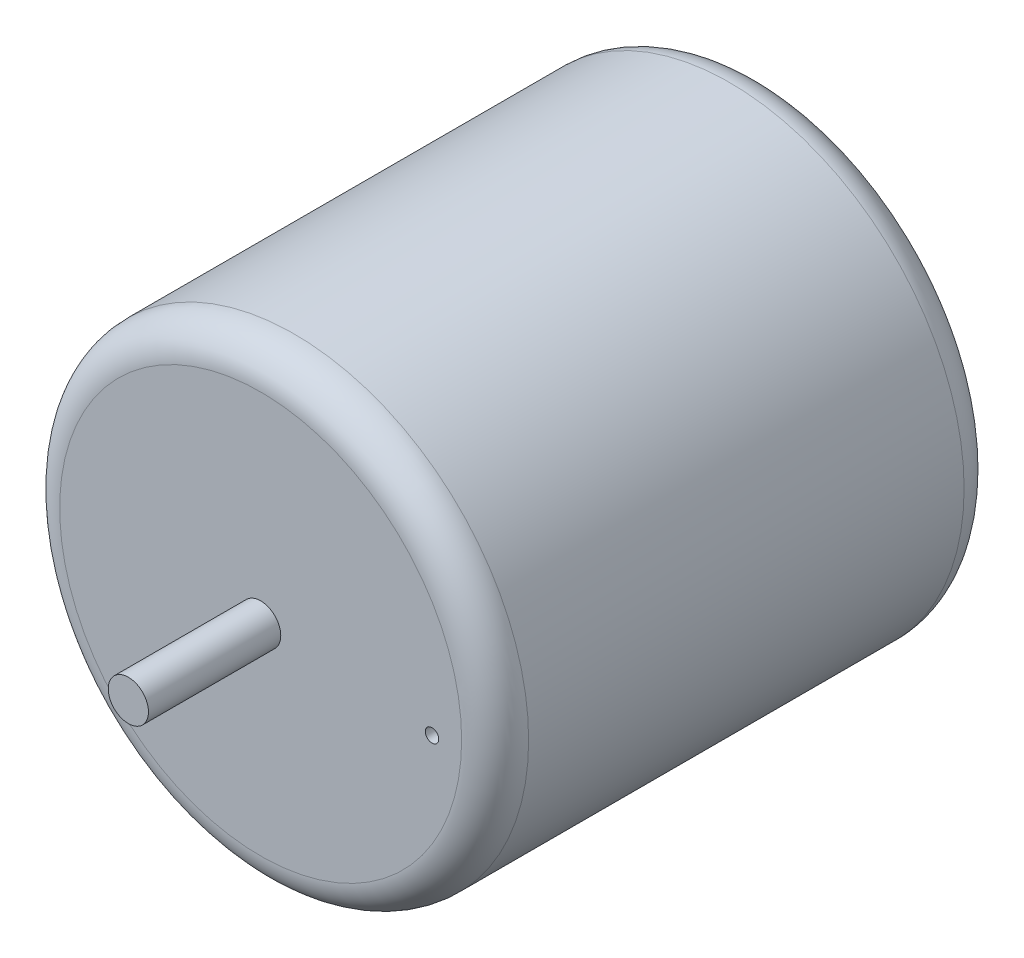
ISO-10303-21;
HEADER;
FILE_DESCRIPTION(('STEP AP214'),'2;1');
FILE_NAME('part.step','',(''),(''),'','','');
FILE_SCHEMA(('AUTOMOTIVE_DESIGN { 1 0 10303 214 1 1 1 1 }'));
ENDSEC;
DATA;
#1=APPLICATION_CONTEXT('core data for automotive mechanical design processes');
#2=APPLICATION_PROTOCOL_DEFINITION('international standard','automotive_design',2000,#1);
#3=PRODUCT_CONTEXT('',#1,'mechanical');
#4=PRODUCT('Part','Part','',(#3));
#5=PRODUCT_RELATED_PRODUCT_CATEGORY('part','',(#4));
#6=PRODUCT_DEFINITION_FORMATION('','',#4);
#7=PRODUCT_DEFINITION_CONTEXT('part definition',#1,'design');
#8=PRODUCT_DEFINITION('design','',#6,#7);
#9=PRODUCT_DEFINITION_SHAPE('','',#8);
#10=(LENGTH_UNIT() NAMED_UNIT(*) SI_UNIT(.MILLI.,.METRE.));
#11=(NAMED_UNIT(*) PLANE_ANGLE_UNIT() SI_UNIT($,.RADIAN.));
#12=(NAMED_UNIT(*) SI_UNIT($,.STERADIAN.) SOLID_ANGLE_UNIT());
#13=UNCERTAINTY_MEASURE_WITH_UNIT(LENGTH_MEASURE(1.E-05),#10,'distance_accuracy_value','');
#14=(GEOMETRIC_REPRESENTATION_CONTEXT(3) GLOBAL_UNCERTAINTY_ASSIGNED_CONTEXT((#13)) GLOBAL_UNIT_ASSIGNED_CONTEXT((#10,
#11,#12)) REPRESENTATION_CONTEXT('',''));
#15=CARTESIAN_POINT('',(0.,0.,0.));
#16=DIRECTION('',(0.,0.,1.));
#17=DIRECTION('',(1.,0.,0.));
#18=AXIS2_PLACEMENT_3D('',#15,#16,#17);
#19=CARTESIAN_POINT('',(0.,0.,7.5));
#20=DIRECTION('',(0.,0.,1.));
#21=DIRECTION('',(1.,0.,0.));
#22=AXIS2_PLACEMENT_3D('',#19,#20,#21);
#23=PLANE('',#22);
#24=CARTESIAN_POINT('',(5.11527520381937,-0.322145194133611,7.5));
#25=DIRECTION('',(0.,0.,1.));
#26=DIRECTION('',(1.,0.,0.));
#27=AXIS2_PLACEMENT_3D('',#24,#25,#26);
#28=CIRCLE('',#27,0.2);
#29=CARTESIAN_POINT('',(5.31527520381937,-0.322145194133611,7.5));
#30=VERTEX_POINT('',#29);
#31=EDGE_CURVE('P0_E72',#30,#30,#28,.T.);
#32=ORIENTED_EDGE('',*,*,#31,.F.);
#33=EDGE_LOOP('',(#32));
#34=FACE_BOUND('',#33,.T.);
#35=CARTESIAN_POINT('',(0.,0.,7.5));
#36=DIRECTION('',(0.,0.,1.));
#37=DIRECTION('',(1.,0.,0.));
#38=AXIS2_PLACEMENT_3D('',#35,#36,#37);
#39=CIRCLE('',#38,6.);
#40=CARTESIAN_POINT('',(6.,0.,7.5));
#41=VERTEX_POINT('',#40);
#42=EDGE_CURVE('P0_E10',#41,#41,#39,.T.);
#43=ORIENTED_EDGE('',*,*,#42,.T.);
#44=EDGE_LOOP('',(#43));
#45=FACE_BOUND('',#44,.T.);
#46=CARTESIAN_POINT('',(0.,0.,7.5));
#47=DIRECTION('',(0.,0.,1.));
#48=DIRECTION('',(1.,0.,0.));
#49=AXIS2_PLACEMENT_3D('',#46,#47,#48);
#50=CIRCLE('',#49,0.6);
#51=CARTESIAN_POINT('',(0.6,0.,7.5));
#52=VERTEX_POINT('',#51);
#53=EDGE_CURVE('P0_E55',#52,#52,#50,.T.);
#54=ORIENTED_EDGE('',*,*,#53,.F.);
#55=EDGE_LOOP('',(#54));
#56=FACE_BOUND('',#55,.T.);
#57=ADVANCED_FACE('P0_F40',(#34,#45,#56),#23,.T.);
#58=CARTESIAN_POINT('',(0.,0.,-7.5));
#59=DIRECTION('',(0.,0.,1.));
#60=DIRECTION('',(1.,0.,0.));
#61=AXIS2_PLACEMENT_3D('',#58,#59,#60);
#62=PLANE('',#61);
#63=CARTESIAN_POINT('',(5.11527520381937,-0.322145194133611,-7.5));
#64=DIRECTION('',(0.,0.,1.));
#65=DIRECTION('',(1.,0.,0.));
#66=AXIS2_PLACEMENT_3D('',#63,#64,#65);
#67=CIRCLE('',#66,0.2);
#68=CARTESIAN_POINT('',(5.31527520381937,-0.322145194133611,-7.5));
#69=VERTEX_POINT('',#68);
#70=EDGE_CURVE('P0_E44',#69,#69,#67,.T.);
#71=ORIENTED_EDGE('',*,*,#70,.T.);
#72=EDGE_LOOP('',(#71));
#73=FACE_BOUND('',#72,.T.);
#74=CARTESIAN_POINT('',(0.,0.,-7.5));
#75=DIRECTION('',(0.,0.,1.));
#76=DIRECTION('',(1.,0.,0.));
#77=AXIS2_PLACEMENT_3D('',#74,#75,#76);
#78=CIRCLE('',#77,6.);
#79=CARTESIAN_POINT('',(6.,0.,-7.5));
#80=VERTEX_POINT('',#79);
#81=EDGE_CURVE('P0_E49',#80,#80,#78,.T.);
#82=ORIENTED_EDGE('',*,*,#81,.F.);
#83=EDGE_LOOP('',(#82));
#84=FACE_BOUND('',#83,.T.);
#85=CARTESIAN_POINT('',(0.,0.,-7.5));
#86=DIRECTION('',(0.,0.,1.));
#87=DIRECTION('',(1.,0.,0.));
#88=AXIS2_PLACEMENT_3D('',#85,#86,#87);
#89=CIRCLE('',#88,0.6);
#90=CARTESIAN_POINT('',(0.6,0.,-7.5));
#91=VERTEX_POINT('',#90);
#92=EDGE_CURVE('P0_E60',#91,#91,#89,.F.);
#93=ORIENTED_EDGE('',*,*,#92,.F.);
#94=EDGE_LOOP('',(#93));
#95=FACE_BOUND('',#94,.T.);
#96=ADVANCED_FACE('P0_F81',(#73,#84,#95),#62,.F.);
#97=CARTESIAN_POINT('',(0.,0.,7.5));
#98=DIRECTION('',(0.,0.,-1.));
#99=DIRECTION('',(-1.,0.,0.));
#100=AXIS2_PLACEMENT_3D('',#97,#98,#99);
#101=CYLINDRICAL_SURFACE('',#100,6.);
#102=ORIENTED_EDGE('',*,*,#42,.F.);
#103=EDGE_LOOP('',(#102));
#104=FACE_BOUND('',#103,.T.);
#105=ORIENTED_EDGE('',*,*,#81,.T.);
#106=EDGE_LOOP('',(#105));
#107=FACE_BOUND('',#106,.T.);
#108=ADVANCED_FACE('P0_F42',(#104,#107),#101,.T.);
#109=CARTESIAN_POINT('',(0.,0.,-11.45));
#110=DIRECTION('',(0.,0.,1.));
#111=DIRECTION('',(1.,0.,0.));
#112=AXIS2_PLACEMENT_3D('',#109,#110,#111);
#113=PLANE('',#112);
#114=CARTESIAN_POINT('',(0.,0.,-11.45));
#115=DIRECTION('',(0.,0.,1.));
#116=DIRECTION('',(1.,0.,0.));
#117=AXIS2_PLACEMENT_3D('',#114,#115,#116);
#118=CIRCLE('',#117,0.6);
#119=CARTESIAN_POINT('',(0.6,0.,-11.45));
#120=VERTEX_POINT('',#119);
#121=EDGE_CURVE('P0_E65',#120,#120,#118,.T.);
#122=ORIENTED_EDGE('',*,*,#121,.F.);
#123=EDGE_LOOP('',(#122));
#124=FACE_BOUND('',#123,.T.);
#125=ADVANCED_FACE('P0_F107',(#124),#113,.F.);
#126=CARTESIAN_POINT('',(0.,0.,11.45));
#127=DIRECTION('',(0.,0.,-1.));
#128=DIRECTION('',(-1.,0.,0.));
#129=AXIS2_PLACEMENT_3D('',#126,#127,#128);
#130=CYLINDRICAL_SURFACE('',#129,0.6);
#131=ORIENTED_EDGE('',*,*,#121,.T.);
#132=EDGE_LOOP('',(#131));
#133=FACE_BOUND('',#132,.T.);
#134=ORIENTED_EDGE('',*,*,#92,.T.);
#135=EDGE_LOOP('',(#134));
#136=FACE_BOUND('',#135,.T.);
#137=ADVANCED_FACE('P0_F105',(#133,#136),#130,.T.);
#138=ORIENTED_EDGE('',*,*,#53,.T.);
#139=EDGE_LOOP('',(#138));
#140=FACE_BOUND('',#139,.T.);
#141=CARTESIAN_POINT('',(0.,0.,11.45));
#142=DIRECTION('',(0.,0.,1.));
#143=DIRECTION('',(1.,0.,0.));
#144=AXIS2_PLACEMENT_3D('',#141,#142,#143);
#145=CIRCLE('',#144,0.6);
#146=CARTESIAN_POINT('',(0.6,0.,11.45));
#147=VERTEX_POINT('',#146);
#148=EDGE_CURVE('P0_E64',#147,#147,#145,.T.);
#149=ORIENTED_EDGE('',*,*,#148,.F.);
#150=EDGE_LOOP('',(#149));
#151=FACE_BOUND('',#150,.T.);
#152=ADVANCED_FACE('P0_F92',(#140,#151),#130,.T.);
#153=CARTESIAN_POINT('',(0.,0.,11.45));
#154=DIRECTION('',(0.,0.,1.));
#155=DIRECTION('',(1.,0.,0.));
#156=AXIS2_PLACEMENT_3D('',#153,#154,#155);
#157=PLANE('',#156);
#158=ORIENTED_EDGE('',*,*,#148,.T.);
#159=EDGE_LOOP('',(#158));
#160=FACE_BOUND('',#159,.T.);
#161=ADVANCED_FACE('P0_F86',(#160),#157,.T.);
#162=CARTESIAN_POINT('',(5.11527520381937,-0.322145194133611,-11.45));
#163=DIRECTION('',(0.,0.,1.));
#164=DIRECTION('',(1.,0.,0.));
#165=AXIS2_PLACEMENT_3D('',#162,#163,#164);
#166=CYLINDRICAL_SURFACE('',#165,0.2);
#167=ORIENTED_EDGE('',*,*,#31,.T.);
#168=EDGE_LOOP('',(#167));
#169=FACE_BOUND('',#168,.T.);
#170=ORIENTED_EDGE('',*,*,#70,.F.);
#171=EDGE_LOOP('',(#170));
#172=FACE_BOUND('',#171,.T.);
#173=ADVANCED_FACE('P0_F84',(#169,#172),#166,.F.);
#174=CLOSED_SHELL('',(#57,#96,#108,#125,#137,#152,#161,#173));
#175=MANIFOLD_SOLID_BREP('P0_B2',#174);
#176=CARTESIAN_POINT('',(0.,0.,7.5));
#177=DIRECTION('',(0.,0.,-1.));
#178=DIRECTION('',(-1.,0.,0.));
#179=AXIS2_PLACEMENT_3D('',#176,#177,#178);
#180=CYLINDRICAL_SURFACE('',#179,7.);
#181=CARTESIAN_POINT('',(0.,0.,-6.5));
#182=DIRECTION('',(0.,0.,1.));
#183=DIRECTION('',(1.,0.,0.));
#184=AXIS2_PLACEMENT_3D('',#181,#182,#183);
#185=CIRCLE('',#184,7.);
#186=CARTESIAN_POINT('',(7.,0.,-6.5));
#187=VERTEX_POINT('',#186);
#188=EDGE_CURVE('P1_E10',#187,#187,#185,.T.);
#189=ORIENTED_EDGE('',*,*,#188,.T.);
#190=EDGE_LOOP('',(#189));
#191=FACE_BOUND('',#190,.T.);
#192=CARTESIAN_POINT('',(0.,0.,6.5));
#193=DIRECTION('',(0.,0.,1.));
#194=DIRECTION('',(1.,0.,0.));
#195=AXIS2_PLACEMENT_3D('',#192,#193,#194);
#196=CIRCLE('',#195,7.);
#197=CARTESIAN_POINT('',(7.,0.,6.5));
#198=VERTEX_POINT('',#197);
#199=EDGE_CURVE('P1_E21',#198,#198,#196,.F.);
#200=ORIENTED_EDGE('',*,*,#199,.T.);
#201=EDGE_LOOP('',(#200));
#202=FACE_BOUND('',#201,.T.);
#203=ADVANCED_FACE('P1_F14',(#191,#202),#180,.T.);
#204=CARTESIAN_POINT('',(0.,0.,7.5));
#205=DIRECTION('',(0.,0.,-1.));
#206=DIRECTION('',(-1.,0.,0.));
#207=AXIS2_PLACEMENT_3D('',#204,#205,#206);
#208=CYLINDRICAL_SURFACE('',#207,6.);
#209=CARTESIAN_POINT('',(0.,0.,7.5));
#210=DIRECTION('',(0.,0.,1.));
#211=DIRECTION('',(1.,0.,0.));
#212=AXIS2_PLACEMENT_3D('',#209,#210,#211);
#213=CIRCLE('',#212,6.);
#214=CARTESIAN_POINT('',(6.,0.,7.5));
#215=VERTEX_POINT('',#214);
#216=EDGE_CURVE('P1_E25',#215,#215,#213,.T.);
#217=ORIENTED_EDGE('',*,*,#216,.T.);
#218=EDGE_LOOP('',(#217));
#219=FACE_BOUND('',#218,.T.);
#220=CARTESIAN_POINT('',(0.,0.,-7.5));
#221=DIRECTION('',(0.,0.,1.));
#222=DIRECTION('',(1.,0.,0.));
#223=AXIS2_PLACEMENT_3D('',#220,#221,#222);
#224=CIRCLE('',#223,6.);
#225=CARTESIAN_POINT('',(6.,0.,-7.5));
#226=VERTEX_POINT('',#225);
#227=EDGE_CURVE('P1_E29',#226,#226,#224,.T.);
#228=ORIENTED_EDGE('',*,*,#227,.F.);
#229=EDGE_LOOP('',(#228));
#230=FACE_BOUND('',#229,.T.);
#231=ADVANCED_FACE('P1_F38',(#219,#230),#208,.F.);
#232=CARTESIAN_POINT('',(0.,0.,-6.5));
#233=DIRECTION('',(0.,0.,1.));
#234=DIRECTION('',(1.,0.,0.));
#235=AXIS2_PLACEMENT_3D('',#232,#233,#234);
#236=TOROIDAL_SURFACE('',#235,6.,1.);
#237=ORIENTED_EDGE('',*,*,#227,.T.);
#238=EDGE_LOOP('',(#237));
#239=FACE_BOUND('',#238,.T.);
#240=ORIENTED_EDGE('',*,*,#188,.F.);
#241=EDGE_LOOP('',(#240));
#242=FACE_BOUND('',#241,.T.);
#243=ADVANCED_FACE('P1_F35',(#239,#242),#236,.T.);
#244=CARTESIAN_POINT('',(0.,0.,6.5));
#245=DIRECTION('',(0.,0.,1.));
#246=DIRECTION('',(1.,0.,0.));
#247=AXIS2_PLACEMENT_3D('',#244,#245,#246);
#248=TOROIDAL_SURFACE('',#247,6.,1.);
#249=ORIENTED_EDGE('',*,*,#199,.F.);
#250=EDGE_LOOP('',(#249));
#251=FACE_BOUND('',#250,.T.);
#252=ORIENTED_EDGE('',*,*,#216,.F.);
#253=EDGE_LOOP('',(#252));
#254=FACE_BOUND('',#253,.T.);
#255=ADVANCED_FACE('P1_F16',(#251,#254),#248,.T.);
#256=CLOSED_SHELL('',(#203,#231,#243,#255));
#257=MANIFOLD_SOLID_BREP('P1_B1',#256);
#258=ADVANCED_BREP_SHAPE_REPRESENTATION('',(#18,#175,#257),#14);
#259=SHAPE_DEFINITION_REPRESENTATION(#9,#258);
ENDSEC;
END-ISO-10303-21;
